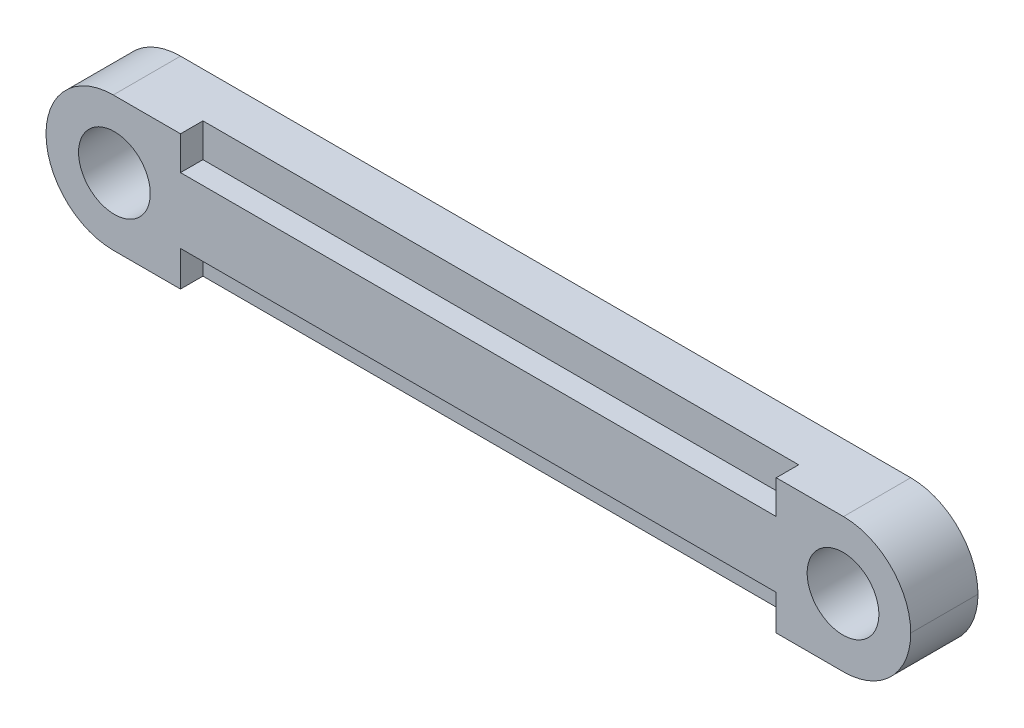
ISO-10303-21;
HEADER;
FILE_DESCRIPTION(('STEP AP214'),'2;1');
FILE_NAME('part.step','',(''),(''),'','','');
FILE_SCHEMA(('AUTOMOTIVE_DESIGN { 1 0 10303 214 1 1 1 1 }'));
ENDSEC;
DATA;
#1=APPLICATION_CONTEXT('core data for automotive mechanical design processes');
#2=APPLICATION_PROTOCOL_DEFINITION('international standard','automotive_design',2000,#1);
#3=PRODUCT_CONTEXT('',#1,'mechanical');
#4=PRODUCT('Part','Part','',(#3));
#5=PRODUCT_RELATED_PRODUCT_CATEGORY('part','',(#4));
#6=PRODUCT_DEFINITION_FORMATION('','',#4);
#7=PRODUCT_DEFINITION_CONTEXT('part definition',#1,'design');
#8=PRODUCT_DEFINITION('design','',#6,#7);
#9=PRODUCT_DEFINITION_SHAPE('','',#8);
#10=(LENGTH_UNIT() NAMED_UNIT(*) SI_UNIT(.MILLI.,.METRE.));
#11=(NAMED_UNIT(*) PLANE_ANGLE_UNIT() SI_UNIT($,.RADIAN.));
#12=(NAMED_UNIT(*) SI_UNIT($,.STERADIAN.) SOLID_ANGLE_UNIT());
#13=UNCERTAINTY_MEASURE_WITH_UNIT(LENGTH_MEASURE(1.E-05),#10,'distance_accuracy_value','');
#14=(GEOMETRIC_REPRESENTATION_CONTEXT(3) GLOBAL_UNCERTAINTY_ASSIGNED_CONTEXT((#13)) GLOBAL_UNIT_ASSIGNED_CONTEXT((#10,
#11,#12)) REPRESENTATION_CONTEXT('',''));
#15=CARTESIAN_POINT('',(0.,0.,0.));
#16=DIRECTION('',(0.,0.,1.));
#17=DIRECTION('',(1.,0.,0.));
#18=AXIS2_PLACEMENT_3D('',#15,#16,#17);
#19=CARTESIAN_POINT('',(0.,0.,2.));
#20=DIRECTION('',(0.,0.,1.));
#21=DIRECTION('',(1.,0.,0.));
#22=AXIS2_PLACEMENT_3D('',#19,#20,#21);
#23=PLANE('',#22);
#24=DIRECTION('',(0.,1.,0.));
#25=VECTOR('',#24,1.);
#26=CARTESIAN_POINT('',(-28.2995939461055,13.9333333333333,2.));
#27=LINE('',#26,#25);
#28=CARTESIAN_POINT('',(-28.2995939461055,12.4333333333333,2.));
#29=VERTEX_POINT('',#28);
#30=CARTESIAN_POINT('',(-28.2995939461055,13.9333333333333,2.));
#31=VERTEX_POINT('',#30);
#32=EDGE_CURVE('E144',#29,#31,#27,.T.);
#33=ORIENTED_EDGE('',*,*,#32,.F.);
#34=DIRECTION('',(-1.,0.,0.));
#35=VECTOR('',#34,1.);
#36=CARTESIAN_POINT('',(-28.2995939461055,12.4333333333333,2.));
#37=LINE('',#36,#35);
#38=CARTESIAN_POINT('',(-1.72597689524045,12.4333333333333,2.));
#39=VERTEX_POINT('',#38);
#40=EDGE_CURVE('E193',#39,#29,#37,.T.);
#41=ORIENTED_EDGE('',*,*,#40,.F.);
#42=DIRECTION('',(0.,-1.,0.));
#43=VECTOR('',#42,1.);
#44=CARTESIAN_POINT('',(-1.72597689524045,13.9333333333333,2.));
#45=LINE('',#44,#43);
#46=CARTESIAN_POINT('',(-1.72597689524045,13.9333333333333,2.));
#47=VERTEX_POINT('',#46);
#48=EDGE_CURVE('E190',#47,#39,#45,.T.);
#49=ORIENTED_EDGE('',*,*,#48,.F.);
#50=DIRECTION('',(-1.,0.,0.));
#51=VECTOR('',#50,1.);
#52=CARTESIAN_POINT('',(-34.2995939461055,13.9333333333333,2.));
#53=LINE('',#52,#51);
#54=EDGE_CURVE('E222',#47,#31,#53,.T.);
#55=ORIENTED_EDGE('',*,*,#54,.T.);
#56=EDGE_LOOP('',(#33,#41,#49,#55));
#57=FACE_BOUND('',#56,.T.);
#58=ADVANCED_FACE('F32',(#57),#23,.T.);
#59=CARTESIAN_POINT('',(-34.2995939461055,7.93333333333333,2.));
#60=DIRECTION('',(0.,1.,0.));
#61=DIRECTION('',(0.,0.,1.));
#62=AXIS2_PLACEMENT_3D('',#59,#60,#61);
#63=PLANE('',#62);
#64=DIRECTION('',(1.,0.,0.));
#65=VECTOR('',#64,1.);
#66=CARTESIAN_POINT('',(-34.2995939461055,7.93333333333333,3.));
#67=LINE('',#66,#65);
#68=CARTESIAN_POINT('',(-31.2995939461055,7.93333333333333,3.));
#69=VERTEX_POINT('',#68);
#70=CARTESIAN_POINT('',(-28.2995939461055,7.93333333333333,3.));
#71=VERTEX_POINT('',#70);
#72=EDGE_CURVE('E133',#69,#71,#67,.T.);
#73=ORIENTED_EDGE('',*,*,#72,.F.);
#74=DIRECTION('',(0.,0.,-1.));
#75=VECTOR('',#74,1.);
#76=CARTESIAN_POINT('',(-31.2995939461055,7.93333333333333,2.));
#77=LINE('',#76,#75);
#78=CARTESIAN_POINT('',(-31.2995939461055,7.93333333333333,0.));
#79=VERTEX_POINT('',#78);
#80=EDGE_CURVE('E231',#69,#79,#77,.T.);
#81=ORIENTED_EDGE('',*,*,#80,.T.);
#82=DIRECTION('',(1.,0.,0.));
#83=VECTOR('',#82,1.);
#84=CARTESIAN_POINT('',(-34.2995939461055,7.93333333333333,0.));
#85=LINE('',#84,#83);
#86=CARTESIAN_POINT('',(1.27402310475955,7.93333333333333,0.));
#87=VERTEX_POINT('',#86);
#88=EDGE_CURVE('E218',#79,#87,#85,.T.);
#89=ORIENTED_EDGE('',*,*,#88,.T.);
#90=DIRECTION('',(0.,0.,-1.));
#91=VECTOR('',#90,1.);
#92=CARTESIAN_POINT('',(1.27402310475955,7.93333333333333,2.));
#93=LINE('',#92,#91);
#94=CARTESIAN_POINT('',(1.27402310475955,7.93333333333333,3.));
#95=VERTEX_POINT('',#94);
#96=EDGE_CURVE('E225',#87,#95,#93,.F.);
#97=ORIENTED_EDGE('',*,*,#96,.T.);
#98=DIRECTION('',(1.,0.,0.));
#99=VECTOR('',#98,1.);
#100=CARTESIAN_POINT('',(4.27402310475955,7.93333333333333,3.));
#101=LINE('',#100,#99);
#102=CARTESIAN_POINT('',(-1.72597689524045,7.93333333333333,3.));
#103=VERTEX_POINT('',#102);
#104=EDGE_CURVE('E167',#103,#95,#101,.T.);
#105=ORIENTED_EDGE('',*,*,#104,.F.);
#106=DIRECTION('',(0.,0.,-1.));
#107=VECTOR('',#106,1.);
#108=CARTESIAN_POINT('',(-1.72597689524045,7.93333333333333,3.));
#109=LINE('',#108,#107);
#110=CARTESIAN_POINT('',(-1.72597689524045,7.93333333333333,2.));
#111=VERTEX_POINT('',#110);
#112=EDGE_CURVE('E209',#103,#111,#109,.T.);
#113=ORIENTED_EDGE('',*,*,#112,.T.);
#114=DIRECTION('',(1.,0.,0.));
#115=VECTOR('',#114,1.);
#116=CARTESIAN_POINT('',(-34.2995939461055,7.93333333333333,2.));
#117=LINE('',#116,#115);
#118=CARTESIAN_POINT('',(-28.2995939461055,7.93333333333333,2.));
#119=VERTEX_POINT('',#118);
#120=EDGE_CURVE('E151',#119,#111,#117,.T.);
#121=ORIENTED_EDGE('',*,*,#120,.F.);
#122=DIRECTION('',(0.,0.,-1.));
#123=VECTOR('',#122,1.);
#124=CARTESIAN_POINT('',(-28.2995939461055,7.93333333333333,3.));
#125=LINE('',#124,#123);
#126=EDGE_CURVE('E148',#71,#119,#125,.T.);
#127=ORIENTED_EDGE('',*,*,#126,.F.);
#128=EDGE_LOOP('',(#73,#81,#89,#97,#105,#113,#121,#127));
#129=FACE_BOUND('',#128,.T.);
#130=ADVANCED_FACE('F149',(#129),#63,.F.);
#131=CARTESIAN_POINT('',(-34.2995939461055,13.9333333333333,2.));
#132=DIRECTION('',(0.,-1.,0.));
#133=DIRECTION('',(0.,0.,-1.));
#134=AXIS2_PLACEMENT_3D('',#131,#132,#133);
#135=PLANE('',#134);
#136=DIRECTION('',(-1.,0.,0.));
#137=VECTOR('',#136,1.);
#138=CARTESIAN_POINT('',(-34.2995939461055,13.9333333333333,0.));
#139=LINE('',#138,#137);
#140=CARTESIAN_POINT('',(1.27402310475955,13.9333333333333,0.));
#141=VERTEX_POINT('',#140);
#142=CARTESIAN_POINT('',(-31.2995939461055,13.9333333333333,0.));
#143=VERTEX_POINT('',#142);
#144=EDGE_CURVE('E223',#141,#143,#139,.T.);
#145=ORIENTED_EDGE('',*,*,#144,.T.);
#146=DIRECTION('',(0.,0.,-1.));
#147=VECTOR('',#146,1.);
#148=CARTESIAN_POINT('',(-31.2995939461055,13.9333333333333,2.));
#149=LINE('',#148,#147);
#150=CARTESIAN_POINT('',(-31.2995939461055,13.9333333333333,3.));
#151=VERTEX_POINT('',#150);
#152=EDGE_CURVE('E11',#143,#151,#149,.F.);
#153=ORIENTED_EDGE('',*,*,#152,.T.);
#154=DIRECTION('',(-1.,0.,0.));
#155=VECTOR('',#154,1.);
#156=CARTESIAN_POINT('',(-34.2995939461055,13.9333333333333,3.));
#157=LINE('',#156,#155);
#158=CARTESIAN_POINT('',(-28.2995939461055,13.9333333333333,3.));
#159=VERTEX_POINT('',#158);
#160=EDGE_CURVE('E178',#159,#151,#157,.T.);
#161=ORIENTED_EDGE('',*,*,#160,.F.);
#162=DIRECTION('',(0.,0.,-1.));
#163=VECTOR('',#162,1.);
#164=CARTESIAN_POINT('',(-28.2995939461055,13.9333333333333,3.));
#165=LINE('',#164,#163);
#166=EDGE_CURVE('E180',#159,#31,#165,.T.);
#167=ORIENTED_EDGE('',*,*,#166,.T.);
#168=ORIENTED_EDGE('',*,*,#54,.F.);
#169=DIRECTION('',(0.,0.,-1.));
#170=VECTOR('',#169,1.);
#171=CARTESIAN_POINT('',(-1.72597689524045,13.9333333333333,3.));
#172=LINE('',#171,#170);
#173=CARTESIAN_POINT('',(-1.72597689524045,13.9333333333333,3.));
#174=VERTEX_POINT('',#173);
#175=EDGE_CURVE('E206',#174,#47,#172,.T.);
#176=ORIENTED_EDGE('',*,*,#175,.F.);
#177=DIRECTION('',(-1.,0.,0.));
#178=VECTOR('',#177,1.);
#179=CARTESIAN_POINT('',(4.27402310475955,13.9333333333333,3.));
#180=LINE('',#179,#178);
#181=CARTESIAN_POINT('',(1.27402310475955,13.9333333333333,3.));
#182=VERTEX_POINT('',#181);
#183=EDGE_CURVE('E170',#182,#174,#180,.T.);
#184=ORIENTED_EDGE('',*,*,#183,.F.);
#185=DIRECTION('',(0.,0.,-1.));
#186=VECTOR('',#185,1.);
#187=CARTESIAN_POINT('',(1.27402310475955,13.9333333333333,2.));
#188=LINE('',#187,#186);
#189=EDGE_CURVE('E41',#182,#141,#188,.T.);
#190=ORIENTED_EDGE('',*,*,#189,.T.);
#191=EDGE_LOOP('',(#145,#153,#161,#167,#168,#176,#184,#190));
#192=FACE_BOUND('',#191,.T.);
#193=ADVANCED_FACE('F263',(#192),#135,.F.);
#194=DIRECTION('',(0.,-1.,0.));
#195=VECTOR('',#194,1.);
#196=CARTESIAN_POINT('',(-1.72597689524045,9.50470056767472,2.));
#197=LINE('',#196,#195);
#198=CARTESIAN_POINT('',(-1.72597689524045,9.50470056767472,2.));
#199=VERTEX_POINT('',#198);
#200=EDGE_CURVE('E187',#199,#111,#197,.T.);
#201=ORIENTED_EDGE('',*,*,#200,.F.);
#202=DIRECTION('',(1.,0.,0.));
#203=VECTOR('',#202,1.);
#204=CARTESIAN_POINT('',(-28.2995939461055,9.50470056767472,2.));
#205=LINE('',#204,#203);
#206=CARTESIAN_POINT('',(-28.2995939461055,9.50470056767472,2.));
#207=VERTEX_POINT('',#206);
#208=EDGE_CURVE('E183',#207,#199,#205,.T.);
#209=ORIENTED_EDGE('',*,*,#208,.F.);
#210=DIRECTION('',(0.,1.,0.));
#211=VECTOR('',#210,1.);
#212=CARTESIAN_POINT('',(-28.2995939461055,9.50470056767472,2.));
#213=LINE('',#212,#211);
#214=EDGE_CURVE('E181',#119,#207,#213,.T.);
#215=ORIENTED_EDGE('',*,*,#214,.F.);
#216=ORIENTED_EDGE('',*,*,#120,.T.);
#217=EDGE_LOOP('',(#201,#209,#215,#216));
#218=FACE_BOUND('',#217,.T.);
#219=ADVANCED_FACE('F299',(#218),#23,.T.);
#220=CARTESIAN_POINT('',(0.,0.,0.));
#221=DIRECTION('',(0.,0.,1.));
#222=DIRECTION('',(1.,0.,0.));
#223=AXIS2_PLACEMENT_3D('',#220,#221,#222);
#224=PLANE('',#223);
#225=CARTESIAN_POINT('',(-31.248722029787,10.9432100325719,0.));
#226=DIRECTION('',(0.,0.,1.));
#227=DIRECTION('',(1.,0.,0.));
#228=AXIS2_PLACEMENT_3D('',#225,#226,#227);
#229=CIRCLE('',#228,1.6);
#230=CARTESIAN_POINT('',(-29.648722029787,10.9432100325719,0.));
#231=VERTEX_POINT('',#230);
#232=EDGE_CURVE('E215',#231,#231,#229,.T.);
#233=ORIENTED_EDGE('',*,*,#232,.T.);
#234=EDGE_LOOP('',(#233));
#235=FACE_BOUND('',#234,.T.);
#236=CARTESIAN_POINT('',(1.251277970213,10.9432100325719,0.));
#237=DIRECTION('',(0.,0.,1.));
#238=DIRECTION('',(1.,0.,0.));
#239=AXIS2_PLACEMENT_3D('',#236,#237,#238);
#240=CIRCLE('',#239,1.6);
#241=CARTESIAN_POINT('',(2.851277970213,10.9432100325719,0.));
#242=VERTEX_POINT('',#241);
#243=EDGE_CURVE('E154',#242,#242,#240,.T.);
#244=ORIENTED_EDGE('',*,*,#243,.T.);
#245=EDGE_LOOP('',(#244));
#246=FACE_BOUND('',#245,.T.);
#247=ORIENTED_EDGE('',*,*,#88,.F.);
#248=CARTESIAN_POINT('',(-31.2995939461055,10.9333333333333,0.));
#249=DIRECTION('',(0.,0.,1.));
#250=DIRECTION('',(1.,0.,0.));
#251=AXIS2_PLACEMENT_3D('',#248,#249,#250);
#252=CIRCLE('',#251,3.);
#253=CARTESIAN_POINT('',(-34.2995939461055,10.9333333333333,0.));
#254=VERTEX_POINT('',#253);
#255=EDGE_CURVE('E239',#79,#254,#252,.F.);
#256=ORIENTED_EDGE('',*,*,#255,.T.);
#257=CARTESIAN_POINT('',(-31.2995939461055,10.9333333333333,0.));
#258=DIRECTION('',(0.,0.,1.));
#259=DIRECTION('',(1.,0.,0.));
#260=AXIS2_PLACEMENT_3D('',#257,#258,#259);
#261=CIRCLE('',#260,3.);
#262=EDGE_CURVE('E237',#254,#143,#261,.F.);
#263=ORIENTED_EDGE('',*,*,#262,.T.);
#264=ORIENTED_EDGE('',*,*,#144,.F.);
#265=CARTESIAN_POINT('',(1.27402310475955,10.9333333333333,0.));
#266=DIRECTION('',(0.,0.,1.));
#267=DIRECTION('',(1.,0.,0.));
#268=AXIS2_PLACEMENT_3D('',#265,#266,#267);
#269=CIRCLE('',#268,3.);
#270=CARTESIAN_POINT('',(4.27402310475955,10.9333333333333,0.));
#271=VERTEX_POINT('',#270);
#272=EDGE_CURVE('E233',#141,#271,#269,.F.);
#273=ORIENTED_EDGE('',*,*,#272,.T.);
#274=CARTESIAN_POINT('',(1.27402310475955,10.9333333333333,0.));
#275=DIRECTION('',(0.,0.,1.));
#276=DIRECTION('',(1.,0.,0.));
#277=AXIS2_PLACEMENT_3D('',#274,#275,#276);
#278=CIRCLE('',#277,3.);
#279=EDGE_CURVE('E235',#271,#87,#278,.F.);
#280=ORIENTED_EDGE('',*,*,#279,.T.);
#281=EDGE_LOOP('',(#247,#256,#263,#264,#273,#280));
#282=FACE_BOUND('',#281,.T.);
#283=ADVANCED_FACE('F267',(#235,#246,#282),#224,.F.);
#284=CARTESIAN_POINT('',(1.251277970213,10.9432100325719,3.));
#285=DIRECTION('',(0.,0.,-1.));
#286=DIRECTION('',(-1.,0.,0.));
#287=AXIS2_PLACEMENT_3D('',#284,#285,#286);
#288=CYLINDRICAL_SURFACE('',#287,1.6);
#289=ORIENTED_EDGE('',*,*,#243,.F.);
#290=EDGE_LOOP('',(#289));
#291=FACE_BOUND('',#290,.T.);
#292=CARTESIAN_POINT('',(1.251277970213,10.9432100325719,3.));
#293=DIRECTION('',(0.,0.,-1.));
#294=DIRECTION('',(-1.,0.,0.));
#295=AXIS2_PLACEMENT_3D('',#292,#293,#294);
#296=CIRCLE('',#295,1.6);
#297=CARTESIAN_POINT('',(-0.348722029787005,10.9432100325719,3.));
#298=VERTEX_POINT('',#297);
#299=EDGE_CURVE('E184',#298,#298,#296,.T.);
#300=ORIENTED_EDGE('',*,*,#299,.F.);
#301=EDGE_LOOP('',(#300));
#302=FACE_BOUND('',#301,.T.);
#303=ADVANCED_FACE('F312',(#291,#302),#288,.F.);
#304=CARTESIAN_POINT('',(-31.248722029787,10.9432100325719,3.));
#305=DIRECTION('',(0.,0.,-1.));
#306=DIRECTION('',(-1.,0.,0.));
#307=AXIS2_PLACEMENT_3D('',#304,#305,#306);
#308=CYLINDRICAL_SURFACE('',#307,1.6);
#309=ORIENTED_EDGE('',*,*,#232,.F.);
#310=EDGE_LOOP('',(#309));
#311=FACE_BOUND('',#310,.T.);
#312=CARTESIAN_POINT('',(-31.248722029787,10.9432100325719,3.));
#313=DIRECTION('',(0.,0.,-1.));
#314=DIRECTION('',(-1.,0.,0.));
#315=AXIS2_PLACEMENT_3D('',#312,#313,#314);
#316=CIRCLE('',#315,1.6);
#317=CARTESIAN_POINT('',(-32.848722029787,10.9432100325719,3.));
#318=VERTEX_POINT('',#317);
#319=EDGE_CURVE('E249',#318,#318,#316,.T.);
#320=ORIENTED_EDGE('',*,*,#319,.F.);
#321=EDGE_LOOP('',(#320));
#322=FACE_BOUND('',#321,.T.);
#323=ADVANCED_FACE('F356',(#311,#322),#308,.F.);
#324=CARTESIAN_POINT('',(0.,0.,3.));
#325=DIRECTION('',(0.,0.,1.));
#326=DIRECTION('',(1.,0.,0.));
#327=AXIS2_PLACEMENT_3D('',#324,#325,#326);
#328=PLANE('',#327);
#329=ORIENTED_EDGE('',*,*,#299,.T.);
#330=EDGE_LOOP('',(#329));
#331=FACE_BOUND('',#330,.T.);
#332=ORIENTED_EDGE('',*,*,#319,.T.);
#333=EDGE_LOOP('',(#332));
#334=FACE_BOUND('',#333,.T.);
#335=CARTESIAN_POINT('',(-31.2995939461055,10.9333333333333,3.));
#336=DIRECTION('',(0.,0.,1.));
#337=DIRECTION('',(1.,0.,0.));
#338=AXIS2_PLACEMENT_3D('',#335,#336,#337);
#339=CIRCLE('',#338,3.);
#340=CARTESIAN_POINT('',(-34.2995939461055,10.9333333333333,3.));
#341=VERTEX_POINT('',#340);
#342=EDGE_CURVE('E244',#151,#341,#339,.T.);
#343=ORIENTED_EDGE('',*,*,#342,.T.);
#344=CARTESIAN_POINT('',(-31.2995939461055,10.9333333333333,3.));
#345=DIRECTION('',(0.,0.,1.));
#346=DIRECTION('',(1.,0.,0.));
#347=AXIS2_PLACEMENT_3D('',#344,#345,#346);
#348=CIRCLE('',#347,3.);
#349=EDGE_CURVE('E140',#341,#69,#348,.T.);
#350=ORIENTED_EDGE('',*,*,#349,.T.);
#351=ORIENTED_EDGE('',*,*,#72,.T.);
#352=DIRECTION('',(0.,1.,0.));
#353=VECTOR('',#352,1.);
#354=CARTESIAN_POINT('',(-28.2995939461055,9.50470056767472,3.));
#355=LINE('',#354,#353);
#356=CARTESIAN_POINT('',(-28.2995939461055,9.50470056767472,3.));
#357=VERTEX_POINT('',#356);
#358=EDGE_CURVE('E137',#71,#357,#355,.T.);
#359=ORIENTED_EDGE('',*,*,#358,.T.);
#360=DIRECTION('',(1.,0.,0.));
#361=VECTOR('',#360,1.);
#362=CARTESIAN_POINT('',(-28.2995939461055,9.50470056767472,3.));
#363=LINE('',#362,#361);
#364=CARTESIAN_POINT('',(-1.72597689524045,9.50470056767472,3.));
#365=VERTEX_POINT('',#364);
#366=EDGE_CURVE('E160',#357,#365,#363,.T.);
#367=ORIENTED_EDGE('',*,*,#366,.T.);
#368=DIRECTION('',(0.,-1.,0.));
#369=VECTOR('',#368,1.);
#370=CARTESIAN_POINT('',(-1.72597689524045,9.50470056767472,3.));
#371=LINE('',#370,#369);
#372=EDGE_CURVE('E162',#365,#103,#371,.T.);
#373=ORIENTED_EDGE('',*,*,#372,.T.);
#374=ORIENTED_EDGE('',*,*,#104,.T.);
#375=CARTESIAN_POINT('',(1.27402310475955,10.9333333333333,3.));
#376=DIRECTION('',(0.,0.,1.));
#377=DIRECTION('',(1.,0.,0.));
#378=AXIS2_PLACEMENT_3D('',#375,#376,#377);
#379=CIRCLE('',#378,3.);
#380=CARTESIAN_POINT('',(4.27402310475955,10.9333333333333,3.));
#381=VERTEX_POINT('',#380);
#382=EDGE_CURVE('E242',#95,#381,#379,.T.);
#383=ORIENTED_EDGE('',*,*,#382,.T.);
#384=CARTESIAN_POINT('',(1.27402310475955,10.9333333333333,3.));
#385=DIRECTION('',(0.,0.,1.));
#386=DIRECTION('',(1.,0.,0.));
#387=AXIS2_PLACEMENT_3D('',#384,#385,#386);
#388=CIRCLE('',#387,3.);
#389=EDGE_CURVE('E55',#381,#182,#388,.T.);
#390=ORIENTED_EDGE('',*,*,#389,.T.);
#391=ORIENTED_EDGE('',*,*,#183,.T.);
#392=DIRECTION('',(0.,-1.,0.));
#393=VECTOR('',#392,1.);
#394=CARTESIAN_POINT('',(-1.72597689524045,13.9333333333333,3.));
#395=LINE('',#394,#393);
#396=CARTESIAN_POINT('',(-1.72597689524045,12.4333333333333,3.));
#397=VERTEX_POINT('',#396);
#398=EDGE_CURVE('E172',#174,#397,#395,.T.);
#399=ORIENTED_EDGE('',*,*,#398,.T.);
#400=DIRECTION('',(-1.,0.,0.));
#401=VECTOR('',#400,1.);
#402=CARTESIAN_POINT('',(-28.2995939461055,12.4333333333333,3.));
#403=LINE('',#402,#401);
#404=CARTESIAN_POINT('',(-28.2995939461055,12.4333333333333,3.));
#405=VERTEX_POINT('',#404);
#406=EDGE_CURVE('E174',#397,#405,#403,.T.);
#407=ORIENTED_EDGE('',*,*,#406,.T.);
#408=DIRECTION('',(0.,1.,0.));
#409=VECTOR('',#408,1.);
#410=CARTESIAN_POINT('',(-28.2995939461055,13.9333333333333,3.));
#411=LINE('',#410,#409);
#412=EDGE_CURVE('E176',#405,#159,#411,.T.);
#413=ORIENTED_EDGE('',*,*,#412,.T.);
#414=ORIENTED_EDGE('',*,*,#160,.T.);
#415=EDGE_LOOP('',(#343,#350,#351,#359,#367,#373,#374,#383,#390,#391,#399,#407,#413,#414));
#416=FACE_BOUND('',#415,.T.);
#417=ADVANCED_FACE('F135',(#331,#334,#416),#328,.T.);
#418=CARTESIAN_POINT('',(-28.2995939461055,13.9333333333333,3.));
#419=DIRECTION('',(-1.,0.,0.));
#420=DIRECTION('',(0.,0.,1.));
#421=AXIS2_PLACEMENT_3D('',#418,#419,#420);
#422=PLANE('',#421);
#423=ORIENTED_EDGE('',*,*,#32,.T.);
#424=ORIENTED_EDGE('',*,*,#166,.F.);
#425=ORIENTED_EDGE('',*,*,#412,.F.);
#426=DIRECTION('',(0.,0.,-1.));
#427=VECTOR('',#426,1.);
#428=CARTESIAN_POINT('',(-28.2995939461055,12.4333333333333,3.));
#429=LINE('',#428,#427);
#430=EDGE_CURVE('E200',#405,#29,#429,.T.);
#431=ORIENTED_EDGE('',*,*,#430,.T.);
#432=EDGE_LOOP('',(#423,#424,#425,#431));
#433=FACE_BOUND('',#432,.T.);
#434=ADVANCED_FACE('F276',(#433),#422,.F.);
#435=CARTESIAN_POINT('',(-28.2995939461055,12.4333333333333,3.));
#436=DIRECTION('',(0.,-1.,0.));
#437=DIRECTION('',(0.,0.,-1.));
#438=AXIS2_PLACEMENT_3D('',#435,#436,#437);
#439=PLANE('',#438);
#440=ORIENTED_EDGE('',*,*,#40,.T.);
#441=ORIENTED_EDGE('',*,*,#430,.F.);
#442=ORIENTED_EDGE('',*,*,#406,.F.);
#443=DIRECTION('',(0.,0.,-1.));
#444=VECTOR('',#443,1.);
#445=CARTESIAN_POINT('',(-1.72597689524045,12.4333333333333,3.));
#446=LINE('',#445,#444);
#447=EDGE_CURVE('E203',#397,#39,#446,.T.);
#448=ORIENTED_EDGE('',*,*,#447,.T.);
#449=EDGE_LOOP('',(#440,#441,#442,#448));
#450=FACE_BOUND('',#449,.T.);
#451=ADVANCED_FACE('F280',(#450),#439,.F.);
#452=CARTESIAN_POINT('',(-1.72597689524045,13.9333333333333,3.));
#453=DIRECTION('',(1.,0.,0.));
#454=DIRECTION('',(0.,1.,0.));
#455=AXIS2_PLACEMENT_3D('',#452,#453,#454);
#456=PLANE('',#455);
#457=ORIENTED_EDGE('',*,*,#48,.T.);
#458=ORIENTED_EDGE('',*,*,#447,.F.);
#459=ORIENTED_EDGE('',*,*,#398,.F.);
#460=ORIENTED_EDGE('',*,*,#175,.T.);
#461=EDGE_LOOP('',(#457,#458,#459,#460));
#462=FACE_BOUND('',#461,.T.);
#463=ADVANCED_FACE('F285',(#462),#456,.F.);
#464=CARTESIAN_POINT('',(-1.72597689524045,9.50470056767472,3.));
#465=DIRECTION('',(1.,0.,0.));
#466=DIRECTION('',(0.,1.,0.));
#467=AXIS2_PLACEMENT_3D('',#464,#465,#466);
#468=PLANE('',#467);
#469=ORIENTED_EDGE('',*,*,#200,.T.);
#470=ORIENTED_EDGE('',*,*,#112,.F.);
#471=ORIENTED_EDGE('',*,*,#372,.F.);
#472=DIRECTION('',(0.,0.,-1.));
#473=VECTOR('',#472,1.);
#474=CARTESIAN_POINT('',(-1.72597689524045,9.50470056767472,3.));
#475=LINE('',#474,#473);
#476=EDGE_CURVE('E211',#365,#199,#475,.T.);
#477=ORIENTED_EDGE('',*,*,#476,.T.);
#478=EDGE_LOOP('',(#469,#470,#471,#477));
#479=FACE_BOUND('',#478,.T.);
#480=ADVANCED_FACE('F287',(#479),#468,.F.);
#481=CARTESIAN_POINT('',(-28.2995939461055,9.50470056767472,3.));
#482=DIRECTION('',(0.,1.,0.));
#483=DIRECTION('',(-1.,0.,0.));
#484=AXIS2_PLACEMENT_3D('',#481,#482,#483);
#485=PLANE('',#484);
#486=ORIENTED_EDGE('',*,*,#208,.T.);
#487=ORIENTED_EDGE('',*,*,#476,.F.);
#488=ORIENTED_EDGE('',*,*,#366,.F.);
#489=DIRECTION('',(0.,0.,-1.));
#490=VECTOR('',#489,1.);
#491=CARTESIAN_POINT('',(-28.2995939461055,9.50470056767472,3.));
#492=LINE('',#491,#490);
#493=EDGE_CURVE('E155',#357,#207,#492,.T.);
#494=ORIENTED_EDGE('',*,*,#493,.T.);
#495=EDGE_LOOP('',(#486,#487,#488,#494));
#496=FACE_BOUND('',#495,.T.);
#497=ADVANCED_FACE('F293',(#496),#485,.F.);
#498=CARTESIAN_POINT('',(-28.2995939461055,9.50470056767472,3.));
#499=DIRECTION('',(-1.,0.,0.));
#500=DIRECTION('',(0.,0.,1.));
#501=AXIS2_PLACEMENT_3D('',#498,#499,#500);
#502=PLANE('',#501);
#503=ORIENTED_EDGE('',*,*,#214,.T.);
#504=ORIENTED_EDGE('',*,*,#493,.F.);
#505=ORIENTED_EDGE('',*,*,#358,.F.);
#506=ORIENTED_EDGE('',*,*,#126,.T.);
#507=EDGE_LOOP('',(#503,#504,#505,#506));
#508=FACE_BOUND('',#507,.T.);
#509=ADVANCED_FACE('F157',(#508),#502,.F.);
#510=CARTESIAN_POINT('',(-31.2995939461055,10.9333333333333,2.));
#511=DIRECTION('',(0.,0.,-1.));
#512=DIRECTION('',(-1.,0.,0.));
#513=AXIS2_PLACEMENT_3D('',#510,#511,#512);
#514=CYLINDRICAL_SURFACE('',#513,3.);
#515=DIRECTION('',(0.,0.,-1.));
#516=VECTOR('',#515,1.);
#517=CARTESIAN_POINT('',(-34.2995939461055,10.9333333333333,2.));
#518=LINE('',#517,#516);
#519=EDGE_CURVE('E247',#341,#254,#518,.T.);
#520=ORIENTED_EDGE('',*,*,#519,.F.);
#521=ORIENTED_EDGE('',*,*,#342,.F.);
#522=ORIENTED_EDGE('',*,*,#152,.F.);
#523=ORIENTED_EDGE('',*,*,#262,.F.);
#524=EDGE_LOOP('',(#520,#521,#522,#523));
#525=FACE_BOUND('',#524,.T.);
#526=ADVANCED_FACE('F270',(#525),#514,.T.);
#527=CARTESIAN_POINT('',(-31.2995939461055,10.9333333333333,2.));
#528=DIRECTION('',(0.,0.,-1.));
#529=DIRECTION('',(-1.,0.,0.));
#530=AXIS2_PLACEMENT_3D('',#527,#528,#529);
#531=CYLINDRICAL_SURFACE('',#530,3.);
#532=ORIENTED_EDGE('',*,*,#349,.F.);
#533=ORIENTED_EDGE('',*,*,#519,.T.);
#534=ORIENTED_EDGE('',*,*,#255,.F.);
#535=ORIENTED_EDGE('',*,*,#80,.F.);
#536=EDGE_LOOP('',(#532,#533,#534,#535));
#537=FACE_BOUND('',#536,.T.);
#538=ADVANCED_FACE('F320',(#537),#531,.T.);
#539=CARTESIAN_POINT('',(1.27402310475955,10.9333333333333,2.));
#540=DIRECTION('',(0.,0.,-1.));
#541=DIRECTION('',(-1.,0.,0.));
#542=AXIS2_PLACEMENT_3D('',#539,#540,#541);
#543=CYLINDRICAL_SURFACE('',#542,3.);
#544=ORIENTED_EDGE('',*,*,#189,.F.);
#545=ORIENTED_EDGE('',*,*,#389,.F.);
#546=DIRECTION('',(0.,0.,-1.));
#547=VECTOR('',#546,1.);
#548=CARTESIAN_POINT('',(4.27402310475955,10.9333333333333,2.));
#549=LINE('',#548,#547);
#550=EDGE_CURVE('E36',#271,#381,#549,.F.);
#551=ORIENTED_EDGE('',*,*,#550,.F.);
#552=ORIENTED_EDGE('',*,*,#272,.F.);
#553=EDGE_LOOP('',(#544,#545,#551,#552));
#554=FACE_BOUND('',#553,.T.);
#555=ADVANCED_FACE('F34',(#554),#543,.T.);
#556=CARTESIAN_POINT('',(1.27402310475955,10.9333333333333,2.));
#557=DIRECTION('',(0.,0.,-1.));
#558=DIRECTION('',(-1.,0.,0.));
#559=AXIS2_PLACEMENT_3D('',#556,#557,#558);
#560=CYLINDRICAL_SURFACE('',#559,3.);
#561=ORIENTED_EDGE('',*,*,#382,.F.);
#562=ORIENTED_EDGE('',*,*,#96,.F.);
#563=ORIENTED_EDGE('',*,*,#279,.F.);
#564=ORIENTED_EDGE('',*,*,#550,.T.);
#565=EDGE_LOOP('',(#561,#562,#563,#564));
#566=FACE_BOUND('',#565,.T.);
#567=ADVANCED_FACE('F257',(#566),#560,.T.);
#568=CLOSED_SHELL('',(#58,#130,#193,#219,#283,#303,#323,#417,#434,#451,#463,#480,#497,#509,#526,
#538,#555,#567));
#569=MANIFOLD_SOLID_BREP('B2',#568);
#570=ADVANCED_BREP_SHAPE_REPRESENTATION('',(#18,#569),#14);
#571=SHAPE_DEFINITION_REPRESENTATION(#9,#570);
ENDSEC;
END-ISO-10303-21;
